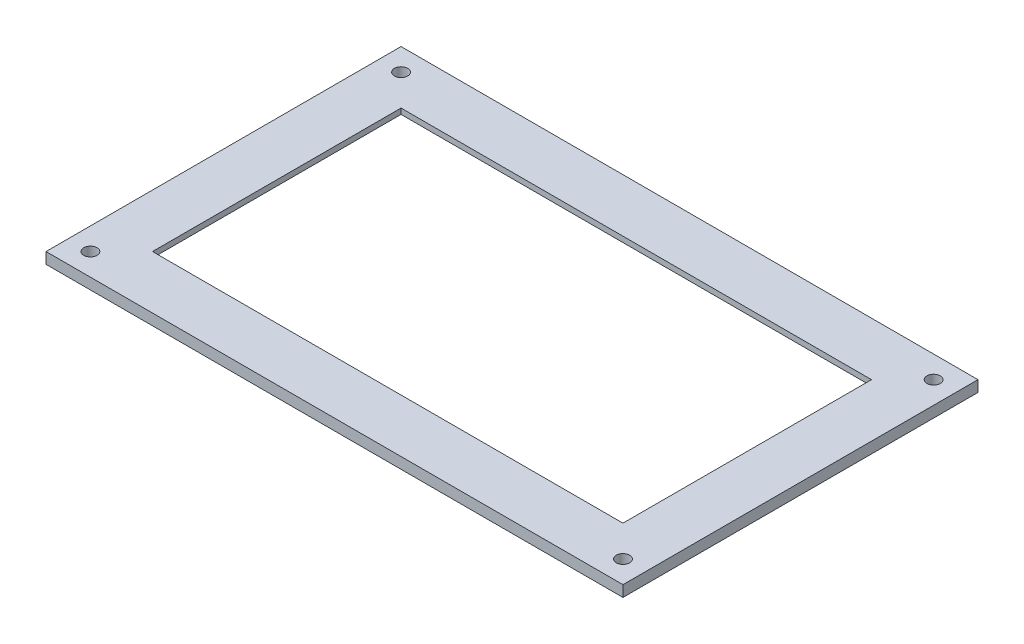
ISO-10303-21;
HEADER;
FILE_DESCRIPTION(('STEP AP214'),'2;1');
FILE_NAME('part.step','',(''),(''),'','','');
FILE_SCHEMA(('AUTOMOTIVE_DESIGN { 1 0 10303 214 1 1 1 1 }'));
ENDSEC;
DATA;
#1=APPLICATION_CONTEXT('core data for automotive mechanical design processes');
#2=APPLICATION_PROTOCOL_DEFINITION('international standard','automotive_design',2000,#1);
#3=PRODUCT_CONTEXT('',#1,'mechanical');
#4=PRODUCT('Part','Part','',(#3));
#5=PRODUCT_RELATED_PRODUCT_CATEGORY('part','',(#4));
#6=PRODUCT_DEFINITION_FORMATION('','',#4);
#7=PRODUCT_DEFINITION_CONTEXT('part definition',#1,'design');
#8=PRODUCT_DEFINITION('design','',#6,#7);
#9=PRODUCT_DEFINITION_SHAPE('','',#8);
#10=(LENGTH_UNIT() NAMED_UNIT(*) SI_UNIT(.MILLI.,.METRE.));
#11=(NAMED_UNIT(*) PLANE_ANGLE_UNIT() SI_UNIT($,.RADIAN.));
#12=(NAMED_UNIT(*) SI_UNIT($,.STERADIAN.) SOLID_ANGLE_UNIT());
#13=UNCERTAINTY_MEASURE_WITH_UNIT(LENGTH_MEASURE(1.E-05),#10,'distance_accuracy_value','');
#14=(GEOMETRIC_REPRESENTATION_CONTEXT(3) GLOBAL_UNCERTAINTY_ASSIGNED_CONTEXT((#13)) GLOBAL_UNIT_ASSIGNED_CONTEXT((#10,
#11,#12)) REPRESENTATION_CONTEXT('',''));
#15=CARTESIAN_POINT('',(0.,0.,0.));
#16=DIRECTION('',(0.,0.,1.));
#17=DIRECTION('',(1.,0.,0.));
#18=AXIS2_PLACEMENT_3D('',#15,#16,#17);
#19=CARTESIAN_POINT('',(0.,1.25,0.));
#20=DIRECTION('',(1.,0.,0.));
#21=DIRECTION('',(0.,0.,-1.));
#22=AXIS2_PLACEMENT_3D('',#19,#20,#21);
#23=PLANE('',#22);
#24=DIRECTION('',(0.,0.,1.));
#25=VECTOR('',#24,1.);
#26=CARTESIAN_POINT('',(0.,0.,0.));
#27=LINE('',#26,#25);
#28=CARTESIAN_POINT('',(0.,0.,-80.));
#29=VERTEX_POINT('',#28);
#30=CARTESIAN_POINT('',(0.,0.,0.));
#31=VERTEX_POINT('',#30);
#32=EDGE_CURVE('E285',#29,#31,#27,.T.);
#33=ORIENTED_EDGE('',*,*,#32,.T.);
#34=DIRECTION('',(0.,-1.,0.));
#35=VECTOR('',#34,1.);
#36=CARTESIAN_POINT('',(0.,1.25,0.));
#37=LINE('',#36,#35);
#38=CARTESIAN_POINT('',(0.,2.5,0.));
#39=VERTEX_POINT('',#38);
#40=EDGE_CURVE('E12',#39,#31,#37,.T.);
#41=ORIENTED_EDGE('',*,*,#40,.F.);
#42=DIRECTION('',(0.,0.,1.));
#43=VECTOR('',#42,1.);
#44=CARTESIAN_POINT('',(0.,2.5,-80.));
#45=LINE('',#44,#43);
#46=CARTESIAN_POINT('',(0.,2.5,-80.));
#47=VERTEX_POINT('',#46);
#48=EDGE_CURVE('E226',#47,#39,#45,.T.);
#49=ORIENTED_EDGE('',*,*,#48,.F.);
#50=DIRECTION('',(0.,-1.,0.));
#51=VECTOR('',#50,1.);
#52=CARTESIAN_POINT('',(0.,1.25,-80.));
#53=LINE('',#52,#51);
#54=EDGE_CURVE('E306',#47,#29,#53,.T.);
#55=ORIENTED_EDGE('',*,*,#54,.T.);
#56=EDGE_LOOP('',(#33,#41,#49,#55));
#57=FACE_BOUND('',#56,.T.);
#58=ADVANCED_FACE('F51',(#57),#23,.F.);
#59=CARTESIAN_POINT('',(0.,1.25,0.));
#60=DIRECTION('',(0.,0.,-1.));
#61=DIRECTION('',(-1.,0.,0.));
#62=AXIS2_PLACEMENT_3D('',#59,#60,#61);
#63=PLANE('',#62);
#64=DIRECTION('',(1.,0.,0.));
#65=VECTOR('',#64,1.);
#66=CARTESIAN_POINT('',(0.,0.,0.));
#67=LINE('',#66,#65);
#68=CARTESIAN_POINT('',(130.,0.,0.));
#69=VERTEX_POINT('',#68);
#70=EDGE_CURVE('E297',#31,#69,#67,.T.);
#71=ORIENTED_EDGE('',*,*,#70,.T.);
#72=DIRECTION('',(0.,-1.,0.));
#73=VECTOR('',#72,1.);
#74=CARTESIAN_POINT('',(130.,1.25,0.));
#75=LINE('',#74,#73);
#76=CARTESIAN_POINT('',(130.,2.5,0.));
#77=VERTEX_POINT('',#76);
#78=EDGE_CURVE('E59',#77,#69,#75,.T.);
#79=ORIENTED_EDGE('',*,*,#78,.F.);
#80=DIRECTION('',(1.,0.,0.));
#81=VECTOR('',#80,1.);
#82=CARTESIAN_POINT('',(0.,2.5,0.));
#83=LINE('',#82,#81);
#84=EDGE_CURVE('E230',#39,#77,#83,.T.);
#85=ORIENTED_EDGE('',*,*,#84,.F.);
#86=ORIENTED_EDGE('',*,*,#40,.T.);
#87=EDGE_LOOP('',(#71,#79,#85,#86));
#88=FACE_BOUND('',#87,.T.);
#89=ADVANCED_FACE('F332',(#88),#63,.F.);
#90=CARTESIAN_POINT('',(130.,1.25,0.));
#91=DIRECTION('',(-1.,0.,0.));
#92=DIRECTION('',(0.,0.,1.));
#93=AXIS2_PLACEMENT_3D('',#90,#91,#92);
#94=PLANE('',#93);
#95=DIRECTION('',(0.,0.,-1.));
#96=VECTOR('',#95,1.);
#97=CARTESIAN_POINT('',(130.,0.,0.));
#98=LINE('',#97,#96);
#99=CARTESIAN_POINT('',(130.,0.,-80.));
#100=VERTEX_POINT('',#99);
#101=EDGE_CURVE('E300',#69,#100,#98,.T.);
#102=ORIENTED_EDGE('',*,*,#101,.T.);
#103=DIRECTION('',(0.,-1.,0.));
#104=VECTOR('',#103,1.);
#105=CARTESIAN_POINT('',(130.,1.25,-80.));
#106=LINE('',#105,#104);
#107=CARTESIAN_POINT('',(130.,2.5,-80.));
#108=VERTEX_POINT('',#107);
#109=EDGE_CURVE('E310',#108,#100,#106,.T.);
#110=ORIENTED_EDGE('',*,*,#109,.F.);
#111=DIRECTION('',(0.,0.,-1.));
#112=VECTOR('',#111,1.);
#113=CARTESIAN_POINT('',(130.,2.5,0.));
#114=LINE('',#113,#112);
#115=EDGE_CURVE('E234',#77,#108,#114,.T.);
#116=ORIENTED_EDGE('',*,*,#115,.F.);
#117=ORIENTED_EDGE('',*,*,#78,.T.);
#118=EDGE_LOOP('',(#102,#110,#116,#117));
#119=FACE_BOUND('',#118,.T.);
#120=ADVANCED_FACE('F319',(#119),#94,.F.);
#121=CARTESIAN_POINT('',(0.,1.25,-80.));
#122=DIRECTION('',(0.,0.,1.));
#123=DIRECTION('',(1.,0.,0.));
#124=AXIS2_PLACEMENT_3D('',#121,#122,#123);
#125=PLANE('',#124);
#126=DIRECTION('',(-1.,0.,0.));
#127=VECTOR('',#126,1.);
#128=CARTESIAN_POINT('',(0.,0.,-80.));
#129=LINE('',#128,#127);
#130=EDGE_CURVE('E303',#100,#29,#129,.T.);
#131=ORIENTED_EDGE('',*,*,#130,.T.);
#132=ORIENTED_EDGE('',*,*,#54,.F.);
#133=DIRECTION('',(-1.,0.,0.));
#134=VECTOR('',#133,1.);
#135=CARTESIAN_POINT('',(130.,2.5,-80.));
#136=LINE('',#135,#134);
#137=EDGE_CURVE('E186',#108,#47,#136,.T.);
#138=ORIENTED_EDGE('',*,*,#137,.F.);
#139=ORIENTED_EDGE('',*,*,#109,.T.);
#140=EDGE_LOOP('',(#131,#132,#138,#139));
#141=FACE_BOUND('',#140,.T.);
#142=ADVANCED_FACE('F327',(#141),#125,.F.);
#143=CARTESIAN_POINT('',(0.,0.,0.));
#144=DIRECTION('',(0.,-1.,0.));
#145=DIRECTION('',(0.,0.,-1.));
#146=AXIS2_PLACEMENT_3D('',#143,#144,#145);
#147=PLANE('',#146);
#148=CARTESIAN_POINT('',(4.99999999999994,0.,-5.));
#149=DIRECTION('',(0.,1.,0.));
#150=DIRECTION('',(0.,0.,1.));
#151=AXIS2_PLACEMENT_3D('',#148,#149,#150);
#152=CIRCLE('',#151,1.5);
#153=CARTESIAN_POINT('',(4.99999999999994,0.,-3.5));
#154=VERTEX_POINT('',#153);
#155=EDGE_CURVE('E238',#154,#154,#152,.T.);
#156=ORIENTED_EDGE('',*,*,#155,.T.);
#157=EDGE_LOOP('',(#156));
#158=FACE_BOUND('',#157,.T.);
#159=CARTESIAN_POINT('',(125.,0.,-5.));
#160=DIRECTION('',(0.,1.,0.));
#161=DIRECTION('',(0.,0.,1.));
#162=AXIS2_PLACEMENT_3D('',#159,#160,#161);
#163=CIRCLE('',#162,1.5);
#164=CARTESIAN_POINT('',(125.,0.,-3.5));
#165=VERTEX_POINT('',#164);
#166=EDGE_CURVE('E244',#165,#165,#163,.T.);
#167=ORIENTED_EDGE('',*,*,#166,.T.);
#168=EDGE_LOOP('',(#167));
#169=FACE_BOUND('',#168,.T.);
#170=CARTESIAN_POINT('',(125.,0.,-75.));
#171=DIRECTION('',(0.,1.,0.));
#172=DIRECTION('',(0.,0.,1.));
#173=AXIS2_PLACEMENT_3D('',#170,#171,#172);
#174=CIRCLE('',#173,1.5);
#175=CARTESIAN_POINT('',(125.,0.,-73.5));
#176=VERTEX_POINT('',#175);
#177=EDGE_CURVE('E239',#176,#176,#174,.T.);
#178=ORIENTED_EDGE('',*,*,#177,.T.);
#179=EDGE_LOOP('',(#178));
#180=FACE_BOUND('',#179,.T.);
#181=CARTESIAN_POINT('',(4.99999999999994,0.,-75.));
#182=DIRECTION('',(0.,1.,0.));
#183=DIRECTION('',(0.,0.,1.));
#184=AXIS2_PLACEMENT_3D('',#181,#182,#183);
#185=CIRCLE('',#184,1.5);
#186=CARTESIAN_POINT('',(4.99999999999994,0.,-73.5));
#187=VERTEX_POINT('',#186);
#188=EDGE_CURVE('E243',#187,#187,#185,.T.);
#189=ORIENTED_EDGE('',*,*,#188,.T.);
#190=EDGE_LOOP('',(#189));
#191=FACE_BOUND('',#190,.T.);
#192=DIRECTION('',(0.,0.,-1.));
#193=VECTOR('',#192,1.);
#194=CARTESIAN_POINT('',(9.99999999999994,0.,-10.));
#195=LINE('',#194,#193);
#196=CARTESIAN_POINT('',(9.99999999999994,0.,-10.));
#197=VERTEX_POINT('',#196);
#198=CARTESIAN_POINT('',(9.99999999999995,0.,-70.));
#199=VERTEX_POINT('',#198);
#200=EDGE_CURVE('E80',#197,#199,#195,.T.);
#201=ORIENTED_EDGE('',*,*,#200,.F.);
#202=DIRECTION('',(-1.,0.,0.));
#203=VECTOR('',#202,1.);
#204=CARTESIAN_POINT('',(9.99999999999994,0.,-10.));
#205=LINE('',#204,#203);
#206=CARTESIAN_POINT('',(120.,0.,-10.));
#207=VERTEX_POINT('',#206);
#208=EDGE_CURVE('E259',#207,#197,#205,.T.);
#209=ORIENTED_EDGE('',*,*,#208,.F.);
#210=DIRECTION('',(0.,0.,1.));
#211=VECTOR('',#210,1.);
#212=CARTESIAN_POINT('',(120.,0.,-10.));
#213=LINE('',#212,#211);
#214=CARTESIAN_POINT('',(120.,0.,-70.));
#215=VERTEX_POINT('',#214);
#216=EDGE_CURVE('E276',#215,#207,#213,.T.);
#217=ORIENTED_EDGE('',*,*,#216,.F.);
#218=DIRECTION('',(1.,0.,0.));
#219=VECTOR('',#218,1.);
#220=CARTESIAN_POINT('',(9.99999999999995,0.,-70.));
#221=LINE('',#220,#219);
#222=EDGE_CURVE('E272',#199,#215,#221,.T.);
#223=ORIENTED_EDGE('',*,*,#222,.F.);
#224=EDGE_LOOP('',(#201,#209,#217,#223));
#225=FACE_BOUND('',#224,.T.);
#226=ORIENTED_EDGE('',*,*,#32,.F.);
#227=ORIENTED_EDGE('',*,*,#130,.F.);
#228=ORIENTED_EDGE('',*,*,#101,.F.);
#229=ORIENTED_EDGE('',*,*,#70,.F.);
#230=EDGE_LOOP('',(#226,#227,#228,#229));
#231=FACE_BOUND('',#230,.T.);
#232=ADVANCED_FACE('F325',(#158,#169,#180,#191,#225,#231),#147,.T.);
#233=CARTESIAN_POINT('',(9.99999999999994,1.25,-10.));
#234=DIRECTION('',(-1.,0.,0.));
#235=DIRECTION('',(0.,0.,1.));
#236=AXIS2_PLACEMENT_3D('',#233,#234,#235);
#237=PLANE('',#236);
#238=ORIENTED_EDGE('',*,*,#200,.T.);
#239=DIRECTION('',(0.,-1.,0.));
#240=VECTOR('',#239,1.);
#241=CARTESIAN_POINT('',(9.99999999999995,1.25,-70.));
#242=LINE('',#241,#240);
#243=CARTESIAN_POINT('',(9.99999999999995,1.25,-70.));
#244=VERTEX_POINT('',#243);
#245=EDGE_CURVE('E269',#244,#199,#242,.T.);
#246=ORIENTED_EDGE('',*,*,#245,.F.);
#247=DIRECTION('',(0.,0.,-1.));
#248=VECTOR('',#247,1.);
#249=CARTESIAN_POINT('',(9.99999999999994,1.25,-10.));
#250=LINE('',#249,#248);
#251=CARTESIAN_POINT('',(9.99999999999994,1.25,-10.));
#252=VERTEX_POINT('',#251);
#253=EDGE_CURVE('E254',#252,#244,#250,.T.);
#254=ORIENTED_EDGE('',*,*,#253,.F.);
#255=DIRECTION('',(0.,-1.,0.));
#256=VECTOR('',#255,1.);
#257=CARTESIAN_POINT('',(9.99999999999994,1.25,-10.));
#258=LINE('',#257,#256);
#259=EDGE_CURVE('E282',#252,#197,#258,.T.);
#260=ORIENTED_EDGE('',*,*,#259,.T.);
#261=EDGE_LOOP('',(#238,#246,#254,#260));
#262=FACE_BOUND('',#261,.T.);
#263=ADVANCED_FACE('F345',(#262),#237,.F.);
#264=CARTESIAN_POINT('',(9.99999999999994,1.25,-10.));
#265=DIRECTION('',(0.,0.,1.));
#266=DIRECTION('',(1.,0.,0.));
#267=AXIS2_PLACEMENT_3D('',#264,#265,#266);
#268=PLANE('',#267);
#269=ORIENTED_EDGE('',*,*,#208,.T.);
#270=ORIENTED_EDGE('',*,*,#259,.F.);
#271=DIRECTION('',(-1.,0.,0.));
#272=VECTOR('',#271,1.);
#273=CARTESIAN_POINT('',(9.99999999999994,1.25,-10.));
#274=LINE('',#273,#272);
#275=CARTESIAN_POINT('',(120.,1.25,-10.));
#276=VERTEX_POINT('',#275);
#277=EDGE_CURVE('E265',#276,#252,#274,.T.);
#278=ORIENTED_EDGE('',*,*,#277,.F.);
#279=DIRECTION('',(0.,-1.,0.));
#280=VECTOR('',#279,1.);
#281=CARTESIAN_POINT('',(120.,1.25,-10.));
#282=LINE('',#281,#280);
#283=EDGE_CURVE('E286',#276,#207,#282,.T.);
#284=ORIENTED_EDGE('',*,*,#283,.T.);
#285=EDGE_LOOP('',(#269,#270,#278,#284));
#286=FACE_BOUND('',#285,.T.);
#287=ADVANCED_FACE('F349',(#286),#268,.F.);
#288=CARTESIAN_POINT('',(120.,1.25,-10.));
#289=DIRECTION('',(1.,0.,0.));
#290=DIRECTION('',(0.,0.,-1.));
#291=AXIS2_PLACEMENT_3D('',#288,#289,#290);
#292=PLANE('',#291);
#293=ORIENTED_EDGE('',*,*,#216,.T.);
#294=ORIENTED_EDGE('',*,*,#283,.F.);
#295=DIRECTION('',(0.,0.,1.));
#296=VECTOR('',#295,1.);
#297=CARTESIAN_POINT('',(120.,1.25,-10.));
#298=LINE('',#297,#296);
#299=CARTESIAN_POINT('',(120.,1.25,-70.));
#300=VERTEX_POINT('',#299);
#301=EDGE_CURVE('E69',#300,#276,#298,.T.);
#302=ORIENTED_EDGE('',*,*,#301,.F.);
#303=DIRECTION('',(0.,-1.,0.));
#304=VECTOR('',#303,1.);
#305=CARTESIAN_POINT('',(120.,1.25,-70.));
#306=LINE('',#305,#304);
#307=EDGE_CURVE('E289',#300,#215,#306,.T.);
#308=ORIENTED_EDGE('',*,*,#307,.T.);
#309=EDGE_LOOP('',(#293,#294,#302,#308));
#310=FACE_BOUND('',#309,.T.);
#311=ADVANCED_FACE('F353',(#310),#292,.F.);
#312=CARTESIAN_POINT('',(9.99999999999995,1.25,-70.));
#313=DIRECTION('',(0.,0.,-1.));
#314=DIRECTION('',(-1.,0.,0.));
#315=AXIS2_PLACEMENT_3D('',#312,#313,#314);
#316=PLANE('',#315);
#317=ORIENTED_EDGE('',*,*,#222,.T.);
#318=ORIENTED_EDGE('',*,*,#307,.F.);
#319=DIRECTION('',(1.,0.,0.));
#320=VECTOR('',#319,1.);
#321=CARTESIAN_POINT('',(9.99999999999995,1.25,-70.));
#322=LINE('',#321,#320);
#323=EDGE_CURVE('E258',#244,#300,#322,.T.);
#324=ORIENTED_EDGE('',*,*,#323,.F.);
#325=ORIENTED_EDGE('',*,*,#245,.T.);
#326=EDGE_LOOP('',(#317,#318,#324,#325));
#327=FACE_BOUND('',#326,.T.);
#328=ADVANCED_FACE('F350',(#327),#316,.F.);
#329=CARTESIAN_POINT('',(4.99999999999994,0.,-75.));
#330=DIRECTION('',(0.,1.,0.));
#331=DIRECTION('',(0.,0.,1.));
#332=AXIS2_PLACEMENT_3D('',#329,#330,#331);
#333=CYLINDRICAL_SURFACE('',#332,1.5);
#334=ORIENTED_EDGE('',*,*,#188,.F.);
#335=EDGE_LOOP('',(#334));
#336=FACE_BOUND('',#335,.T.);
#337=CARTESIAN_POINT('',(4.99999999999994,2.5,-75.));
#338=DIRECTION('',(0.,-1.,0.));
#339=DIRECTION('',(0.,0.,-1.));
#340=AXIS2_PLACEMENT_3D('',#337,#338,#339);
#341=CIRCLE('',#340,1.5);
#342=CARTESIAN_POINT('',(4.99999999999994,2.5,-76.5));
#343=VERTEX_POINT('',#342);
#344=EDGE_CURVE('E207',#343,#343,#341,.T.);
#345=ORIENTED_EDGE('',*,*,#344,.F.);
#346=EDGE_LOOP('',(#345));
#347=FACE_BOUND('',#346,.T.);
#348=ADVANCED_FACE('F352',(#336,#347),#333,.F.);
#349=CARTESIAN_POINT('',(125.,0.,-75.));
#350=DIRECTION('',(0.,1.,0.));
#351=DIRECTION('',(0.,0.,1.));
#352=AXIS2_PLACEMENT_3D('',#349,#350,#351);
#353=CYLINDRICAL_SURFACE('',#352,1.5);
#354=ORIENTED_EDGE('',*,*,#177,.F.);
#355=EDGE_LOOP('',(#354));
#356=FACE_BOUND('',#355,.T.);
#357=CARTESIAN_POINT('',(125.,2.5,-75.));
#358=DIRECTION('',(0.,-1.,0.));
#359=DIRECTION('',(0.,0.,-1.));
#360=AXIS2_PLACEMENT_3D('',#357,#358,#359);
#361=CIRCLE('',#360,1.5);
#362=CARTESIAN_POINT('',(125.,2.5,-76.5));
#363=VERTEX_POINT('',#362);
#364=EDGE_CURVE('E556',#363,#363,#361,.T.);
#365=ORIENTED_EDGE('',*,*,#364,.F.);
#366=EDGE_LOOP('',(#365));
#367=FACE_BOUND('',#366,.T.);
#368=ADVANCED_FACE('F362',(#356,#367),#353,.F.);
#369=CARTESIAN_POINT('',(125.,0.,-5.));
#370=DIRECTION('',(0.,1.,0.));
#371=DIRECTION('',(0.,0.,1.));
#372=AXIS2_PLACEMENT_3D('',#369,#370,#371);
#373=CYLINDRICAL_SURFACE('',#372,1.5);
#374=ORIENTED_EDGE('',*,*,#166,.F.);
#375=EDGE_LOOP('',(#374));
#376=FACE_BOUND('',#375,.T.);
#377=CARTESIAN_POINT('',(125.,2.5,-5.));
#378=DIRECTION('',(0.,-1.,0.));
#379=DIRECTION('',(0.,0.,-1.));
#380=AXIS2_PLACEMENT_3D('',#377,#378,#379);
#381=CIRCLE('',#380,1.5);
#382=CARTESIAN_POINT('',(125.,2.5,-6.5));
#383=VERTEX_POINT('',#382);
#384=EDGE_CURVE('E560',#383,#383,#381,.T.);
#385=ORIENTED_EDGE('',*,*,#384,.F.);
#386=EDGE_LOOP('',(#385));
#387=FACE_BOUND('',#386,.T.);
#388=ADVANCED_FACE('F368',(#376,#387),#373,.F.);
#389=CARTESIAN_POINT('',(4.99999999999994,0.,-5.));
#390=DIRECTION('',(0.,1.,0.));
#391=DIRECTION('',(0.,0.,1.));
#392=AXIS2_PLACEMENT_3D('',#389,#390,#391);
#393=CYLINDRICAL_SURFACE('',#392,1.5);
#394=ORIENTED_EDGE('',*,*,#155,.F.);
#395=EDGE_LOOP('',(#394));
#396=FACE_BOUND('',#395,.T.);
#397=CARTESIAN_POINT('',(4.99999999999994,2.5,-5.));
#398=DIRECTION('',(0.,-1.,0.));
#399=DIRECTION('',(0.,0.,-1.));
#400=AXIS2_PLACEMENT_3D('',#397,#398,#399);
#401=CIRCLE('',#400,1.5);
#402=CARTESIAN_POINT('',(4.99999999999994,2.5,-6.5));
#403=VERTEX_POINT('',#402);
#404=EDGE_CURVE('E564',#403,#403,#401,.T.);
#405=ORIENTED_EDGE('',*,*,#404,.F.);
#406=EDGE_LOOP('',(#405));
#407=FACE_BOUND('',#406,.T.);
#408=ADVANCED_FACE('F364',(#396,#407),#393,.F.);
#409=CARTESIAN_POINT('',(12.,2.5,-68.));
#410=DIRECTION('',(0.,0.,1.));
#411=DIRECTION('',(1.,0.,0.));
#412=AXIS2_PLACEMENT_3D('',#409,#410,#411);
#413=PLANE('',#412);
#414=DIRECTION('',(-1.,0.,0.));
#415=VECTOR('',#414,1.);
#416=CARTESIAN_POINT('',(12.,1.25,-68.));
#417=LINE('',#416,#415);
#418=CARTESIAN_POINT('',(118.,1.25,-68.));
#419=VERTEX_POINT('',#418);
#420=CARTESIAN_POINT('',(12.,1.25,-68.));
#421=VERTEX_POINT('',#420);
#422=EDGE_CURVE('E178',#419,#421,#417,.T.);
#423=ORIENTED_EDGE('',*,*,#422,.F.);
#424=DIRECTION('',(0.,-1.,0.));
#425=VECTOR('',#424,1.);
#426=CARTESIAN_POINT('',(118.,2.5,-68.));
#427=LINE('',#426,#425);
#428=CARTESIAN_POINT('',(118.,2.5,-68.));
#429=VERTEX_POINT('',#428);
#430=EDGE_CURVE('E218',#429,#419,#427,.T.);
#431=ORIENTED_EDGE('',*,*,#430,.F.);
#432=DIRECTION('',(-1.,0.,0.));
#433=VECTOR('',#432,1.);
#434=CARTESIAN_POINT('',(12.,2.5,-68.));
#435=LINE('',#434,#433);
#436=CARTESIAN_POINT('',(12.,2.5,-68.));
#437=VERTEX_POINT('',#436);
#438=EDGE_CURVE('E198',#429,#437,#435,.T.);
#439=ORIENTED_EDGE('',*,*,#438,.T.);
#440=DIRECTION('',(0.,-1.,0.));
#441=VECTOR('',#440,1.);
#442=CARTESIAN_POINT('',(12.,2.5,-68.));
#443=LINE('',#442,#441);
#444=EDGE_CURVE('E172',#437,#421,#443,.T.);
#445=ORIENTED_EDGE('',*,*,#444,.T.);
#446=EDGE_LOOP('',(#423,#431,#439,#445));
#447=FACE_BOUND('',#446,.T.);
#448=ADVANCED_FACE('F367',(#447),#413,.T.);
#449=CARTESIAN_POINT('',(118.,2.5,-68.));
#450=DIRECTION('',(-1.,0.,0.));
#451=DIRECTION('',(0.,0.,1.));
#452=AXIS2_PLACEMENT_3D('',#449,#450,#451);
#453=PLANE('',#452);
#454=DIRECTION('',(0.,0.,-1.));
#455=VECTOR('',#454,1.);
#456=CARTESIAN_POINT('',(118.,1.25,-68.));
#457=LINE('',#456,#455);
#458=CARTESIAN_POINT('',(118.,1.25,-12.));
#459=VERTEX_POINT('',#458);
#460=EDGE_CURVE('E209',#459,#419,#457,.T.);
#461=ORIENTED_EDGE('',*,*,#460,.F.);
#462=DIRECTION('',(0.,-1.,0.));
#463=VECTOR('',#462,1.);
#464=CARTESIAN_POINT('',(118.,2.5,-12.));
#465=LINE('',#464,#463);
#466=CARTESIAN_POINT('',(118.,2.5,-12.));
#467=VERTEX_POINT('',#466);
#468=EDGE_CURVE('E187',#467,#459,#465,.T.);
#469=ORIENTED_EDGE('',*,*,#468,.F.);
#470=DIRECTION('',(0.,0.,-1.));
#471=VECTOR('',#470,1.);
#472=CARTESIAN_POINT('',(118.,2.5,-68.));
#473=LINE('',#472,#471);
#474=EDGE_CURVE('E192',#467,#429,#473,.T.);
#475=ORIENTED_EDGE('',*,*,#474,.T.);
#476=ORIENTED_EDGE('',*,*,#430,.T.);
#477=EDGE_LOOP('',(#461,#469,#475,#476));
#478=FACE_BOUND('',#477,.T.);
#479=ADVANCED_FACE('F387',(#478),#453,.T.);
#480=CARTESIAN_POINT('',(12.,2.5,-12.));
#481=DIRECTION('',(0.,0.,-1.));
#482=DIRECTION('',(-1.,0.,0.));
#483=AXIS2_PLACEMENT_3D('',#480,#481,#482);
#484=PLANE('',#483);
#485=DIRECTION('',(1.,0.,0.));
#486=VECTOR('',#485,1.);
#487=CARTESIAN_POINT('',(12.,1.25,-12.));
#488=LINE('',#487,#486);
#489=CARTESIAN_POINT('',(12.,1.25,-12.));
#490=VERTEX_POINT('',#489);
#491=EDGE_CURVE('E184',#490,#459,#488,.T.);
#492=ORIENTED_EDGE('',*,*,#491,.F.);
#493=DIRECTION('',(0.,-1.,0.));
#494=VECTOR('',#493,1.);
#495=CARTESIAN_POINT('',(12.,2.5,-12.));
#496=LINE('',#495,#494);
#497=CARTESIAN_POINT('',(12.,2.5,-12.));
#498=VERTEX_POINT('',#497);
#499=EDGE_CURVE('E169',#498,#490,#496,.T.);
#500=ORIENTED_EDGE('',*,*,#499,.F.);
#501=DIRECTION('',(1.,0.,0.));
#502=VECTOR('',#501,1.);
#503=CARTESIAN_POINT('',(12.,2.5,-12.));
#504=LINE('',#503,#502);
#505=EDGE_CURVE('E177',#498,#467,#504,.T.);
#506=ORIENTED_EDGE('',*,*,#505,.T.);
#507=ORIENTED_EDGE('',*,*,#468,.T.);
#508=EDGE_LOOP('',(#492,#500,#506,#507));
#509=FACE_BOUND('',#508,.T.);
#510=ADVANCED_FACE('F181',(#509),#484,.T.);
#511=CARTESIAN_POINT('',(12.,2.5,-68.));
#512=DIRECTION('',(1.,0.,0.));
#513=DIRECTION('',(0.,0.,-1.));
#514=AXIS2_PLACEMENT_3D('',#511,#512,#513);
#515=PLANE('',#514);
#516=DIRECTION('',(0.,0.,1.));
#517=VECTOR('',#516,1.);
#518=CARTESIAN_POINT('',(12.,1.25,-68.));
#519=LINE('',#518,#517);
#520=EDGE_CURVE('E204',#421,#490,#519,.T.);
#521=ORIENTED_EDGE('',*,*,#520,.F.);
#522=ORIENTED_EDGE('',*,*,#444,.F.);
#523=DIRECTION('',(0.,0.,1.));
#524=VECTOR('',#523,1.);
#525=CARTESIAN_POINT('',(12.,2.5,-68.));
#526=LINE('',#525,#524);
#527=EDGE_CURVE('E166',#437,#498,#526,.T.);
#528=ORIENTED_EDGE('',*,*,#527,.T.);
#529=ORIENTED_EDGE('',*,*,#499,.T.);
#530=EDGE_LOOP('',(#521,#522,#528,#529));
#531=FACE_BOUND('',#530,.T.);
#532=ADVANCED_FACE('F168',(#531),#515,.T.);
#533=CARTESIAN_POINT('',(0.,2.5,0.));
#534=DIRECTION('',(0.,1.,0.));
#535=DIRECTION('',(0.,0.,1.));
#536=AXIS2_PLACEMENT_3D('',#533,#534,#535);
#537=PLANE('',#536);
#538=ORIENTED_EDGE('',*,*,#364,.T.);
#539=EDGE_LOOP('',(#538));
#540=FACE_BOUND('',#539,.T.);
#541=ORIENTED_EDGE('',*,*,#384,.T.);
#542=EDGE_LOOP('',(#541));
#543=FACE_BOUND('',#542,.T.);
#544=ORIENTED_EDGE('',*,*,#404,.T.);
#545=EDGE_LOOP('',(#544));
#546=FACE_BOUND('',#545,.T.);
#547=ORIENTED_EDGE('',*,*,#344,.T.);
#548=EDGE_LOOP('',(#547));
#549=FACE_BOUND('',#548,.T.);
#550=ORIENTED_EDGE('',*,*,#137,.T.);
#551=ORIENTED_EDGE('',*,*,#48,.T.);
#552=ORIENTED_EDGE('',*,*,#84,.T.);
#553=ORIENTED_EDGE('',*,*,#115,.T.);
#554=EDGE_LOOP('',(#550,#551,#552,#553));
#555=FACE_BOUND('',#554,.T.);
#556=ORIENTED_EDGE('',*,*,#505,.F.);
#557=ORIENTED_EDGE('',*,*,#527,.F.);
#558=ORIENTED_EDGE('',*,*,#438,.F.);
#559=ORIENTED_EDGE('',*,*,#474,.F.);
#560=EDGE_LOOP('',(#556,#557,#558,#559));
#561=FACE_BOUND('',#560,.T.);
#562=ADVANCED_FACE('F190',(#540,#543,#546,#549,#555,#561),#537,.T.);
#563=CARTESIAN_POINT('',(0.,1.25,0.));
#564=DIRECTION('',(0.,1.,0.));
#565=DIRECTION('',(0.,0.,1.));
#566=AXIS2_PLACEMENT_3D('',#563,#564,#565);
#567=PLANE('',#566);
#568=ORIENTED_EDGE('',*,*,#520,.T.);
#569=ORIENTED_EDGE('',*,*,#491,.T.);
#570=ORIENTED_EDGE('',*,*,#460,.T.);
#571=ORIENTED_EDGE('',*,*,#422,.T.);
#572=EDGE_LOOP('',(#568,#569,#570,#571));
#573=FACE_BOUND('',#572,.T.);
#574=ORIENTED_EDGE('',*,*,#301,.T.);
#575=ORIENTED_EDGE('',*,*,#277,.T.);
#576=ORIENTED_EDGE('',*,*,#253,.T.);
#577=ORIENTED_EDGE('',*,*,#323,.T.);
#578=EDGE_LOOP('',(#574,#575,#576,#577));
#579=FACE_BOUND('',#578,.T.);
#580=ADVANCED_FACE('F376',(#573,#579),#567,.F.);
#581=CLOSED_SHELL('',(#58,#89,#120,#142,#232,#263,#287,#311,#328,#348,#368,#388,#408,#448,#479,
#510,#532,#562,#580));
#582=MANIFOLD_SOLID_BREP('B2',#581);
#583=ADVANCED_BREP_SHAPE_REPRESENTATION('',(#18,#582),#14);
#584=SHAPE_DEFINITION_REPRESENTATION(#9,#583);
ENDSEC;
END-ISO-10303-21;
